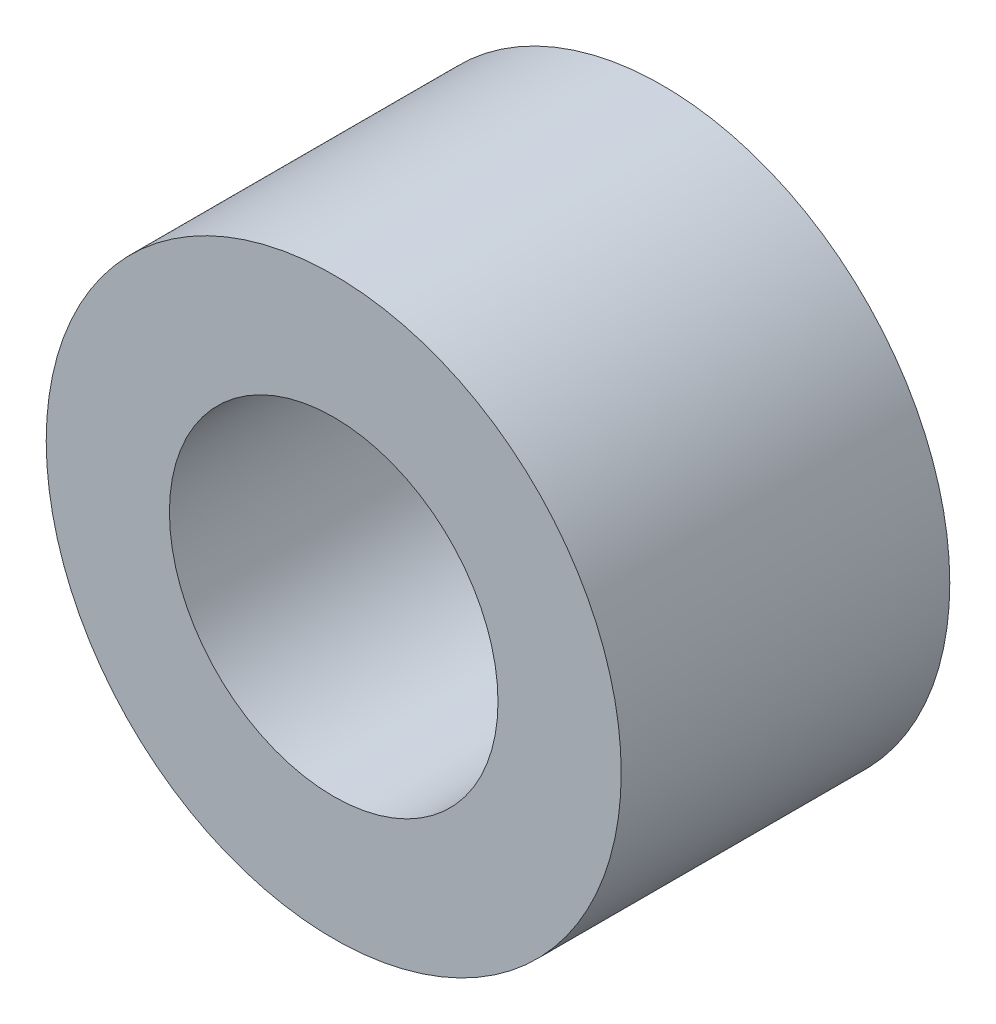
ISO-10303-21;
HEADER;
FILE_DESCRIPTION(('STEP AP214'),'2;1');
FILE_NAME('part.step','',(''),(''),'','','');
FILE_SCHEMA(('AUTOMOTIVE_DESIGN { 1 0 10303 214 1 1 1 1 }'));
ENDSEC;
DATA;
#1=APPLICATION_CONTEXT('core data for automotive mechanical design processes');
#2=APPLICATION_PROTOCOL_DEFINITION('international standard','automotive_design',2000,#1);
#3=PRODUCT_CONTEXT('',#1,'mechanical');
#4=PRODUCT('Part','Part','',(#3));
#5=PRODUCT_RELATED_PRODUCT_CATEGORY('part','',(#4));
#6=PRODUCT_DEFINITION_FORMATION('','',#4);
#7=PRODUCT_DEFINITION_CONTEXT('part definition',#1,'design');
#8=PRODUCT_DEFINITION('design','',#6,#7);
#9=PRODUCT_DEFINITION_SHAPE('','',#8);
#10=(LENGTH_UNIT() NAMED_UNIT(*) SI_UNIT(.MILLI.,.METRE.));
#11=(NAMED_UNIT(*) PLANE_ANGLE_UNIT() SI_UNIT($,.RADIAN.));
#12=(NAMED_UNIT(*) SI_UNIT($,.STERADIAN.) SOLID_ANGLE_UNIT());
#13=UNCERTAINTY_MEASURE_WITH_UNIT(LENGTH_MEASURE(1.E-05),#10,'distance_accuracy_value','');
#14=(GEOMETRIC_REPRESENTATION_CONTEXT(3) GLOBAL_UNCERTAINTY_ASSIGNED_CONTEXT((#13)) GLOBAL_UNIT_ASSIGNED_CONTEXT((#10,
#11,#12)) REPRESENTATION_CONTEXT('',''));
#15=CARTESIAN_POINT('',(0.,0.,0.));
#16=DIRECTION('',(0.,0.,1.));
#17=DIRECTION('',(1.,0.,0.));
#18=AXIS2_PLACEMENT_3D('',#15,#16,#17);
#19=CARTESIAN_POINT('',(0.,0.,4.));
#20=DIRECTION('',(0.,0.,1.));
#21=DIRECTION('',(1.,0.,0.));
#22=AXIS2_PLACEMENT_3D('',#19,#20,#21);
#23=PLANE('',#22);
#24=CARTESIAN_POINT('',(0.,0.,4.));
#25=DIRECTION('',(0.,0.,1.));
#26=DIRECTION('',(1.,0.,0.));
#27=AXIS2_PLACEMENT_3D('',#24,#25,#26);
#28=CIRCLE('',#27,3.5);
#29=CARTESIAN_POINT('',(3.5,0.,4.));
#30=VERTEX_POINT('',#29);
#31=EDGE_CURVE('E10',#30,#30,#28,.T.);
#32=ORIENTED_EDGE('',*,*,#31,.T.);
#33=EDGE_LOOP('',(#32));
#34=FACE_BOUND('',#33,.T.);
#35=CARTESIAN_POINT('',(0.,0.,4.));
#36=DIRECTION('',(0.,0.,1.));
#37=DIRECTION('',(1.,0.,0.));
#38=AXIS2_PLACEMENT_3D('',#35,#36,#37);
#39=CIRCLE('',#38,2.);
#40=CARTESIAN_POINT('',(2.,0.,4.));
#41=VERTEX_POINT('',#40);
#42=EDGE_CURVE('E52',#41,#41,#39,.T.);
#43=ORIENTED_EDGE('',*,*,#42,.F.);
#44=EDGE_LOOP('',(#43));
#45=FACE_BOUND('',#44,.T.);
#46=ADVANCED_FACE('F41',(#34,#45),#23,.T.);
#47=CARTESIAN_POINT('',(0.,0.,0.));
#48=DIRECTION('',(0.,0.,1.));
#49=DIRECTION('',(1.,0.,0.));
#50=AXIS2_PLACEMENT_3D('',#47,#48,#49);
#51=PLANE('',#50);
#52=CARTESIAN_POINT('',(0.,0.,0.));
#53=DIRECTION('',(0.,0.,1.));
#54=DIRECTION('',(1.,0.,0.));
#55=AXIS2_PLACEMENT_3D('',#52,#53,#54);
#56=CIRCLE('',#55,3.5);
#57=CARTESIAN_POINT('',(3.5,0.,0.));
#58=VERTEX_POINT('',#57);
#59=EDGE_CURVE('E45',#58,#58,#56,.T.);
#60=ORIENTED_EDGE('',*,*,#59,.F.);
#61=EDGE_LOOP('',(#60));
#62=FACE_BOUND('',#61,.T.);
#63=CARTESIAN_POINT('',(0.,0.,0.));
#64=DIRECTION('',(0.,0.,1.));
#65=DIRECTION('',(1.,0.,0.));
#66=AXIS2_PLACEMENT_3D('',#63,#64,#65);
#67=CIRCLE('',#66,2.);
#68=CARTESIAN_POINT('',(2.,0.,0.));
#69=VERTEX_POINT('',#68);
#70=EDGE_CURVE('E54',#69,#69,#67,.T.);
#71=ORIENTED_EDGE('',*,*,#70,.T.);
#72=EDGE_LOOP('',(#71));
#73=FACE_BOUND('',#72,.T.);
#74=ADVANCED_FACE('F64',(#62,#73),#51,.F.);
#75=CARTESIAN_POINT('',(0.,0.,4.));
#76=DIRECTION('',(0.,0.,-1.));
#77=DIRECTION('',(-1.,0.,0.));
#78=AXIS2_PLACEMENT_3D('',#75,#76,#77);
#79=CYLINDRICAL_SURFACE('',#78,3.5);
#80=ORIENTED_EDGE('',*,*,#31,.F.);
#81=EDGE_LOOP('',(#80));
#82=FACE_BOUND('',#81,.T.);
#83=ORIENTED_EDGE('',*,*,#59,.T.);
#84=EDGE_LOOP('',(#83));
#85=FACE_BOUND('',#84,.T.);
#86=ADVANCED_FACE('F43',(#82,#85),#79,.T.);
#87=CARTESIAN_POINT('',(0.,0.,4.));
#88=DIRECTION('',(0.,0.,-1.));
#89=DIRECTION('',(-1.,0.,0.));
#90=AXIS2_PLACEMENT_3D('',#87,#88,#89);
#91=CYLINDRICAL_SURFACE('',#90,2.);
#92=ORIENTED_EDGE('',*,*,#42,.T.);
#93=EDGE_LOOP('',(#92));
#94=FACE_BOUND('',#93,.T.);
#95=ORIENTED_EDGE('',*,*,#70,.F.);
#96=EDGE_LOOP('',(#95));
#97=FACE_BOUND('',#96,.T.);
#98=ADVANCED_FACE('F60',(#94,#97),#91,.F.);
#99=CLOSED_SHELL('',(#46,#74,#86,#98));
#100=MANIFOLD_SOLID_BREP('B2',#99);
#101=ADVANCED_BREP_SHAPE_REPRESENTATION('',(#18,#100),#14);
#102=SHAPE_DEFINITION_REPRESENTATION(#9,#101);
ENDSEC;
END-ISO-10303-21;
